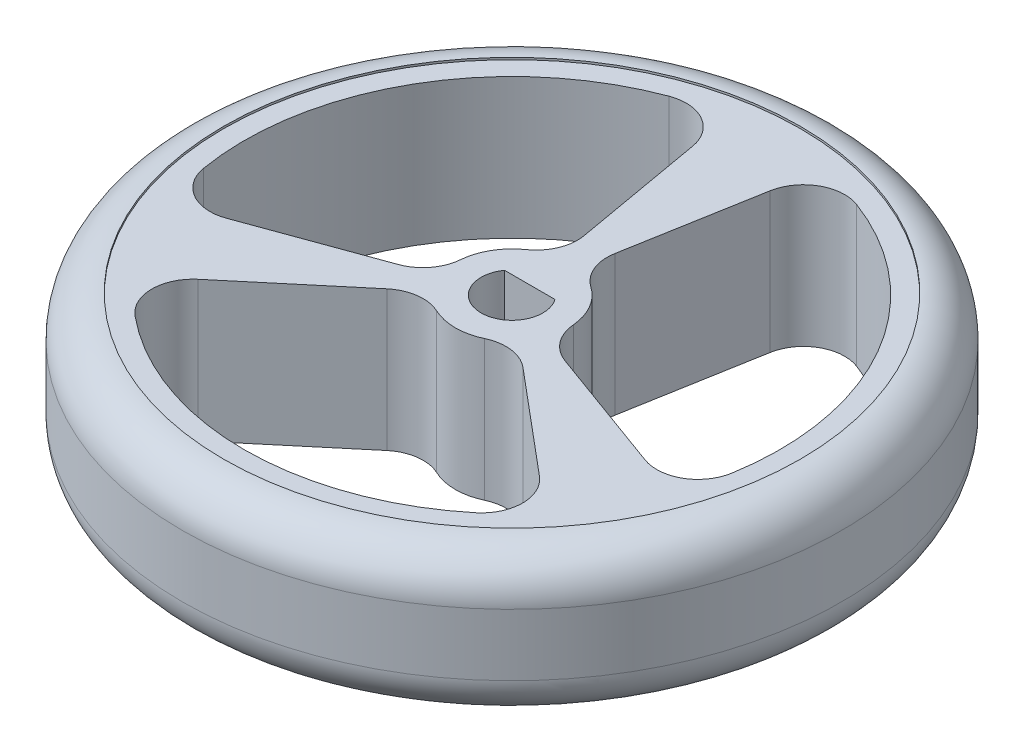
ISO-10303-21;
HEADER;
FILE_DESCRIPTION(('STEP AP214'),'2;1');
FILE_NAME('part.step','',(''),(''),'','','');
FILE_SCHEMA(('AUTOMOTIVE_DESIGN { 1 0 10303 214 1 1 1 1 }'));
ENDSEC;
DATA;
#1=APPLICATION_CONTEXT('core data for automotive mechanical design processes');
#2=APPLICATION_PROTOCOL_DEFINITION('international standard','automotive_design',2000,#1);
#3=PRODUCT_CONTEXT('',#1,'mechanical');
#4=PRODUCT('Part','Part','',(#3));
#5=PRODUCT_RELATED_PRODUCT_CATEGORY('part','',(#4));
#6=PRODUCT_DEFINITION_FORMATION('','',#4);
#7=PRODUCT_DEFINITION_CONTEXT('part definition',#1,'design');
#8=PRODUCT_DEFINITION('design','',#6,#7);
#9=PRODUCT_DEFINITION_SHAPE('','',#8);
#10=(LENGTH_UNIT() NAMED_UNIT(*) SI_UNIT(.MILLI.,.METRE.));
#11=(NAMED_UNIT(*) PLANE_ANGLE_UNIT() SI_UNIT($,.RADIAN.));
#12=(NAMED_UNIT(*) SI_UNIT($,.STERADIAN.) SOLID_ANGLE_UNIT());
#13=UNCERTAINTY_MEASURE_WITH_UNIT(LENGTH_MEASURE(1.E-05),#10,'distance_accuracy_value','');
#14=(GEOMETRIC_REPRESENTATION_CONTEXT(3) GLOBAL_UNCERTAINTY_ASSIGNED_CONTEXT((#13)) GLOBAL_UNIT_ASSIGNED_CONTEXT((#10,
#11,#12)) REPRESENTATION_CONTEXT('',''));
#15=CARTESIAN_POINT('',(0.,0.,0.));
#16=DIRECTION('',(0.,0.,1.));
#17=DIRECTION('',(1.,0.,0.));
#18=AXIS2_PLACEMENT_3D('',#15,#16,#17);
#19=CARTESIAN_POINT('',(0.,3.5,0.));
#20=DIRECTION('',(0.,-1.,0.));
#21=DIRECTION('',(0.,0.,-1.));
#22=AXIS2_PLACEMENT_3D('',#19,#20,#21);
#23=CYLINDRICAL_SURFACE('',#22,1.5);
#24=DIRECTION('',(0.,-1.,0.));
#25=VECTOR('',#24,1.);
#26=CARTESIAN_POINT('',(1.22723011289652,3.5,-0.8625));
#27=LINE('',#26,#25);
#28=CARTESIAN_POINT('',(1.22723011289652,3.4,-0.8625));
#29=VERTEX_POINT('',#28);
#30=CARTESIAN_POINT('',(1.22723011289652,-3.4,-0.8625));
#31=VERTEX_POINT('',#30);
#32=EDGE_CURVE('E361',#29,#31,#27,.T.);
#33=ORIENTED_EDGE('',*,*,#32,.T.);
#34=CARTESIAN_POINT('',(0.,-3.4,0.));
#35=DIRECTION('',(0.,-1.,0.));
#36=DIRECTION('',(0.,0.,-1.));
#37=AXIS2_PLACEMENT_3D('',#34,#35,#36);
#38=CIRCLE('',#37,1.5);
#39=CARTESIAN_POINT('',(-1.22723011289652,-3.4,-0.8625));
#40=VERTEX_POINT('',#39);
#41=EDGE_CURVE('E48',#31,#40,#38,.T.);
#42=ORIENTED_EDGE('',*,*,#41,.T.);
#43=DIRECTION('',(0.,-1.,0.));
#44=VECTOR('',#43,1.);
#45=CARTESIAN_POINT('',(-1.22723011289652,3.5,-0.8625));
#46=LINE('',#45,#44);
#47=CARTESIAN_POINT('',(-1.22723011289652,3.4,-0.8625));
#48=VERTEX_POINT('',#47);
#49=EDGE_CURVE('E364',#48,#40,#46,.T.);
#50=ORIENTED_EDGE('',*,*,#49,.F.);
#51=CARTESIAN_POINT('',(0.,3.4,0.));
#52=DIRECTION('',(0.,1.,0.));
#53=DIRECTION('',(0.,0.,1.));
#54=AXIS2_PLACEMENT_3D('',#51,#52,#53);
#55=CIRCLE('',#54,1.5);
#56=EDGE_CURVE('E358',#48,#29,#55,.T.);
#57=ORIENTED_EDGE('',*,*,#56,.T.);
#58=EDGE_LOOP('',(#33,#42,#50,#57));
#59=FACE_BOUND('',#58,.T.);
#60=ADVANCED_FACE('F34',(#59),#23,.F.);
#61=CARTESIAN_POINT('',(0.,3.5,0.));
#62=DIRECTION('',(0.,-1.,0.));
#63=DIRECTION('',(0.,0.,-1.));
#64=AXIS2_PLACEMENT_3D('',#61,#62,#63);
#65=CYLINDRICAL_SURFACE('',#64,2.75);
#66=CARTESIAN_POINT('',(0.,-3.4,0.));
#67=DIRECTION('',(0.,-1.,0.));
#68=DIRECTION('',(0.,0.,-1.));
#69=AXIS2_PLACEMENT_3D('',#66,#67,#68);
#70=CIRCLE('',#69,2.75);
#71=CARTESIAN_POINT('',(1.57344297134494,-3.4,-2.25538848448005));
#72=VERTEX_POINT('',#71);
#73=CARTESIAN_POINT('',(2.73994520863507,-3.4,-0.234947342350827));
#74=VERTEX_POINT('',#73);
#75=EDGE_CURVE('E412',#72,#74,#70,.T.);
#76=ORIENTED_EDGE('',*,*,#75,.F.);
#77=DIRECTION('',(0.,-1.,0.));
#78=VECTOR('',#77,1.);
#79=CARTESIAN_POINT('',(1.57344297134494,3.5,-2.25538848448005));
#80=LINE('',#79,#78);
#81=CARTESIAN_POINT('',(1.57344297134494,3.4,-2.25538848448005));
#82=VERTEX_POINT('',#81);
#83=EDGE_CURVE('E276',#72,#82,#80,.F.);
#84=ORIENTED_EDGE('',*,*,#83,.T.);
#85=CARTESIAN_POINT('',(0.,3.4,0.));
#86=DIRECTION('',(0.,1.,0.));
#87=DIRECTION('',(0.,0.,1.));
#88=AXIS2_PLACEMENT_3D('',#85,#86,#87);
#89=CIRCLE('',#88,2.75);
#90=CARTESIAN_POINT('',(2.73994520863507,3.4,-0.234947342350827));
#91=VERTEX_POINT('',#90);
#92=EDGE_CURVE('E351',#91,#82,#89,.T.);
#93=ORIENTED_EDGE('',*,*,#92,.F.);
#94=DIRECTION('',(0.,-1.,0.));
#95=VECTOR('',#94,1.);
#96=CARTESIAN_POINT('',(2.73994520863507,3.5,-0.234947342350827));
#97=LINE('',#96,#95);
#98=EDGE_CURVE('E278',#91,#74,#97,.T.);
#99=ORIENTED_EDGE('',*,*,#98,.T.);
#100=EDGE_LOOP('',(#76,#84,#93,#99));
#101=FACE_BOUND('',#100,.T.);
#102=ADVANCED_FACE('F471',(#101),#65,.T.);
#103=CARTESIAN_POINT('',(0.,3.5,0.));
#104=DIRECTION('',(-0.984807753012207,0.,-0.173648177666938));
#105=DIRECTION('',(-0.173648177666938,0.,0.984807753012207));
#106=AXIS2_PLACEMENT_3D('',#103,#104,#105);
#107=PLANE('',#106);
#108=DIRECTION('',(-0.173648177666938,0.,0.984807753012207));
#109=VECTOR('',#108,1.);
#110=CARTESIAN_POINT('',(0.,-3.4,0.));
#111=LINE('',#110,#109);
#112=CARTESIAN_POINT('',(1.87829222540707,-3.4,-10.65232454988));
#113=VERTEX_POINT('',#112);
#114=CARTESIAN_POINT('',(0.748149626298667,-3.4,-4.24296737398123));
#115=VERTEX_POINT('',#114);
#116=EDGE_CURVE('E414',#113,#115,#111,.T.);
#117=ORIENTED_EDGE('',*,*,#116,.F.);
#118=DIRECTION('',(0.,-1.,0.));
#119=VECTOR('',#118,1.);
#120=CARTESIAN_POINT('',(1.87829222540707,3.5,-10.65232454988));
#121=LINE('',#120,#119);
#122=CARTESIAN_POINT('',(1.87829222540707,3.4,-10.65232454988));
#123=VERTEX_POINT('',#122);
#124=EDGE_CURVE('E286',#113,#123,#121,.F.);
#125=ORIENTED_EDGE('',*,*,#124,.T.);
#126=DIRECTION('',(0.173648177666938,0.,-0.984807753012207));
#127=VECTOR('',#126,1.);
#128=CARTESIAN_POINT('',(0.,3.4,0.));
#129=LINE('',#128,#127);
#130=CARTESIAN_POINT('',(0.748149626298667,3.4,-4.24296737398123));
#131=VERTEX_POINT('',#130);
#132=EDGE_CURVE('E348',#131,#123,#129,.T.);
#133=ORIENTED_EDGE('',*,*,#132,.F.);
#134=DIRECTION('',(0.,1.,0.));
#135=VECTOR('',#134,1.);
#136=CARTESIAN_POINT('',(0.748149626298667,-3.5,-4.24296737398123));
#137=LINE('',#136,#135);
#138=EDGE_CURVE('E288',#131,#115,#137,.F.);
#139=ORIENTED_EDGE('',*,*,#138,.T.);
#140=EDGE_LOOP('',(#117,#125,#133,#139));
#141=FACE_BOUND('',#140,.T.);
#142=ADVANCED_FACE('F477',(#141),#107,.F.);
#143=CARTESIAN_POINT('',(0.,3.5,0.));
#144=DIRECTION('',(0.,-1.,0.));
#145=DIRECTION('',(0.,0.,-1.));
#146=AXIS2_PLACEMENT_3D('',#143,#144,#145);
#147=CYLINDRICAL_SURFACE('',#146,13.);
#148=DIRECTION('',(0.,-1.,0.));
#149=VECTOR('',#148,1.);
#150=CARTESIAN_POINT('',(4.54752731896448,3.5,-12.1786696844636));
#151=LINE('',#150,#149);
#152=CARTESIAN_POINT('',(4.54752731896448,3.4,-12.1786696844636));
#153=VERTEX_POINT('',#152);
#154=CARTESIAN_POINT('',(4.54752731896448,-3.4,-12.1786696844636));
#155=VERTEX_POINT('',#154);
#156=EDGE_CURVE('E293',#153,#155,#151,.T.);
#157=ORIENTED_EDGE('',*,*,#156,.T.);
#158=CARTESIAN_POINT('',(0.,-3.4,0.));
#159=DIRECTION('',(0.,-1.,0.));
#160=DIRECTION('',(0.,0.,-1.));
#161=AXIS2_PLACEMENT_3D('',#158,#159,#160);
#162=CIRCLE('',#161,13.);
#163=CARTESIAN_POINT('',(12.8208009905271,-3.4,2.15106065960479));
#164=VERTEX_POINT('',#163);
#165=EDGE_CURVE('E420',#155,#164,#162,.T.);
#166=ORIENTED_EDGE('',*,*,#165,.T.);
#167=DIRECTION('',(0.,-1.,0.));
#168=VECTOR('',#167,1.);
#169=CARTESIAN_POINT('',(12.8208009905271,3.5,2.15106065960479));
#170=LINE('',#169,#168);
#171=CARTESIAN_POINT('',(12.8208009905271,3.4,2.15106065960479));
#172=VERTEX_POINT('',#171);
#173=EDGE_CURVE('E291',#164,#172,#170,.F.);
#174=ORIENTED_EDGE('',*,*,#173,.T.);
#175=CARTESIAN_POINT('',(0.,3.4,0.));
#176=DIRECTION('',(0.,1.,0.));
#177=DIRECTION('',(0.,0.,1.));
#178=AXIS2_PLACEMENT_3D('',#175,#176,#177);
#179=CIRCLE('',#178,13.);
#180=EDGE_CURVE('E341',#172,#153,#179,.T.);
#181=ORIENTED_EDGE('',*,*,#180,.T.);
#182=EDGE_LOOP('',(#157,#166,#174,#181));
#183=FACE_BOUND('',#182,.T.);
#184=ADVANCED_FACE('F494',(#183),#147,.F.);
#185=CARTESIAN_POINT('',(0.,3.5,0.));
#186=DIRECTION('',(-0.984807753012209,0.,0.173648177666924));
#187=DIRECTION('',(0.173648177666924,0.,0.984807753012209));
#188=AXIS2_PLACEMENT_3D('',#185,#186,#187);
#189=PLANE('',#188);
#190=DIRECTION('',(0.,1.,0.));
#191=VECTOR('',#190,1.);
#192=CARTESIAN_POINT('',(-1.87829222540692,-3.5,-10.65232454988));
#193=LINE('',#192,#191);
#194=CARTESIAN_POINT('',(-1.87829222540692,3.4,-10.65232454988));
#195=VERTEX_POINT('',#194);
#196=CARTESIAN_POINT('',(-1.87829222540692,-3.4,-10.65232454988));
#197=VERTEX_POINT('',#196);
#198=EDGE_CURVE('E243',#195,#197,#193,.F.);
#199=ORIENTED_EDGE('',*,*,#198,.T.);
#200=DIRECTION('',(0.173648177666924,0.,0.984807753012209));
#201=VECTOR('',#200,1.);
#202=CARTESIAN_POINT('',(0.,-3.4,0.));
#203=LINE('',#202,#201);
#204=CARTESIAN_POINT('',(-0.748149626298607,-3.4,-4.24296737398124));
#205=VERTEX_POINT('',#204);
#206=EDGE_CURVE('E210',#197,#205,#203,.T.);
#207=ORIENTED_EDGE('',*,*,#206,.T.);
#208=DIRECTION('',(0.,-1.,0.));
#209=VECTOR('',#208,1.);
#210=CARTESIAN_POINT('',(-0.748149626298607,3.5,-4.24296737398124));
#211=LINE('',#210,#209);
#212=CARTESIAN_POINT('',(-0.748149626298607,3.4,-4.24296737398124));
#213=VERTEX_POINT('',#212);
#214=EDGE_CURVE('E245',#205,#213,#211,.F.);
#215=ORIENTED_EDGE('',*,*,#214,.T.);
#216=DIRECTION('',(-0.173648177666924,0.,-0.984807753012209));
#217=VECTOR('',#216,1.);
#218=CARTESIAN_POINT('',(0.,3.4,0.));
#219=LINE('',#218,#217);
#220=EDGE_CURVE('E238',#213,#195,#219,.T.);
#221=ORIENTED_EDGE('',*,*,#220,.T.);
#222=EDGE_LOOP('',(#199,#207,#215,#221));
#223=FACE_BOUND('',#222,.T.);
#224=ADVANCED_FACE('F242',(#223),#189,.T.);
#225=CARTESIAN_POINT('',(0.,-3.4,0.));
#226=DIRECTION('',(0.,-1.,0.));
#227=DIRECTION('',(0.,0.,-1.));
#228=AXIS2_PLACEMENT_3D('',#225,#226,#227);
#229=CIRCLE('',#228,2.75);
#230=CARTESIAN_POINT('',(-2.73994520863508,-3.4,-0.234947342350669));
#231=VERTEX_POINT('',#230);
#232=CARTESIAN_POINT('',(-1.57344297134491,-3.4,-2.25538848448007));
#233=VERTEX_POINT('',#232);
#234=EDGE_CURVE('E379',#231,#233,#229,.T.);
#235=ORIENTED_EDGE('',*,*,#234,.F.);
#236=DIRECTION('',(0.,-1.,0.));
#237=VECTOR('',#236,1.);
#238=CARTESIAN_POINT('',(-2.73994520863508,3.5,-0.234947342350669));
#239=LINE('',#238,#237);
#240=CARTESIAN_POINT('',(-2.73994520863508,3.4,-0.234947342350669));
#241=VERTEX_POINT('',#240);
#242=EDGE_CURVE('E253',#231,#241,#239,.F.);
#243=ORIENTED_EDGE('',*,*,#242,.T.);
#244=CARTESIAN_POINT('',(0.,3.4,0.));
#245=DIRECTION('',(0.,1.,0.));
#246=DIRECTION('',(0.,0.,1.));
#247=AXIS2_PLACEMENT_3D('',#244,#245,#246);
#248=CIRCLE('',#247,2.75);
#249=CARTESIAN_POINT('',(-1.57344297134491,3.4,-2.25538848448007));
#250=VERTEX_POINT('',#249);
#251=EDGE_CURVE('E321',#250,#241,#248,.T.);
#252=ORIENTED_EDGE('',*,*,#251,.F.);
#253=DIRECTION('',(0.,-1.,0.));
#254=VECTOR('',#253,1.);
#255=CARTESIAN_POINT('',(-1.57344297134491,3.5,-2.25538848448007));
#256=LINE('',#255,#254);
#257=EDGE_CURVE('E248',#250,#233,#256,.T.);
#258=ORIENTED_EDGE('',*,*,#257,.T.);
#259=EDGE_LOOP('',(#235,#243,#252,#258));
#260=FACE_BOUND('',#259,.T.);
#261=ADVANCED_FACE('F377',(#260),#65,.T.);
#262=CARTESIAN_POINT('',(0.,3.5,1.4569079967223E-13));
#263=DIRECTION('',(0.342020143325662,0.,0.939692620785911));
#264=DIRECTION('',(0.939692620785911,0.,-0.342020143325662));
#265=AXIS2_PLACEMENT_3D('',#262,#263,#264);
#266=PLANE('',#265);
#267=DIRECTION('',(0.939692620785911,0.,-0.342020143325662));
#268=VECTOR('',#267,1.);
#269=CARTESIAN_POINT('',(0.,-3.4,1.4569079967223E-13));
#270=LINE('',#269,#268);
#271=CARTESIAN_POINT('',(-10.1643297822562,-3.4,3.6995134920068));
#272=VERTEX_POINT('',#271);
#273=CARTESIAN_POINT('',(-4.04859234644564,-3.4,1.4735671047843));
#274=VERTEX_POINT('',#273);
#275=EDGE_CURVE('E393',#272,#274,#270,.T.);
#276=ORIENTED_EDGE('',*,*,#275,.F.);
#277=DIRECTION('',(0.,-1.,0.));
#278=VECTOR('',#277,1.);
#279=CARTESIAN_POINT('',(-10.1643297822562,3.5,3.6995134920068));
#280=LINE('',#279,#278);
#281=CARTESIAN_POINT('',(-10.1643297822562,3.4,3.6995134920068));
#282=VERTEX_POINT('',#281);
#283=EDGE_CURVE('E250',#272,#282,#280,.F.);
#284=ORIENTED_EDGE('',*,*,#283,.T.);
#285=DIRECTION('',(-0.939692620785911,0.,0.342020143325662));
#286=VECTOR('',#285,1.);
#287=CARTESIAN_POINT('',(0.,3.4,1.4569079967223E-13));
#288=LINE('',#287,#286);
#289=CARTESIAN_POINT('',(-4.04859234644564,3.4,1.4735671047843));
#290=VERTEX_POINT('',#289);
#291=EDGE_CURVE('E386',#290,#282,#288,.T.);
#292=ORIENTED_EDGE('',*,*,#291,.F.);
#293=DIRECTION('',(0.,1.,0.));
#294=VECTOR('',#293,1.);
#295=CARTESIAN_POINT('',(-4.04859234644564,-3.5,1.4735671047843));
#296=LINE('',#295,#294);
#297=EDGE_CURVE('E258',#290,#274,#296,.F.);
#298=ORIENTED_EDGE('',*,*,#297,.T.);
#299=EDGE_LOOP('',(#276,#284,#292,#298));
#300=FACE_BOUND('',#299,.T.);
#301=ADVANCED_FACE('F392',(#300),#266,.F.);
#302=CARTESIAN_POINT('',(1.21820169157485E-13,3.5,1.45179624243869E-13));
#303=DIRECTION('',(0.642787609686534,0.,0.766044443118982));
#304=DIRECTION('',(0.766044443118982,0.,-0.642787609686534));
#305=AXIS2_PLACEMENT_3D('',#302,#303,#304);
#306=PLANE('',#305);
#307=DIRECTION('',(0.,1.,0.));
#308=VECTOR('',#307,1.);
#309=CARTESIAN_POINT('',(-8.2860375568491,-3.5,6.95281105787332));
#310=LINE('',#309,#308);
#311=CARTESIAN_POINT('',(-8.2860375568491,3.4,6.95281105787332));
#312=VERTEX_POINT('',#311);
#313=CARTESIAN_POINT('',(-8.2860375568491,-3.4,6.95281105787332));
#314=VERTEX_POINT('',#313);
#315=EDGE_CURVE('E266',#312,#314,#310,.F.);
#316=ORIENTED_EDGE('',*,*,#315,.T.);
#317=DIRECTION('',(0.766044443118982,0.,-0.642787609686534));
#318=VECTOR('',#317,1.);
#319=CARTESIAN_POINT('',(1.21820169157485E-13,-3.4,1.45179624243869E-13));
#320=LINE('',#319,#318);
#321=CARTESIAN_POINT('',(-3.30044272014681,-3.4,2.76940026919714));
#322=VERTEX_POINT('',#321);
#323=EDGE_CURVE('E436',#314,#322,#320,.T.);
#324=ORIENTED_EDGE('',*,*,#323,.T.);
#325=DIRECTION('',(0.,-1.,0.));
#326=VECTOR('',#325,1.);
#327=CARTESIAN_POINT('',(-3.30044272014681,3.5,2.76940026919714));
#328=LINE('',#327,#326);
#329=CARTESIAN_POINT('',(-3.30044272014681,3.4,2.76940026919714));
#330=VERTEX_POINT('',#329);
#331=EDGE_CURVE('E269',#322,#330,#328,.F.);
#332=ORIENTED_EDGE('',*,*,#331,.T.);
#333=DIRECTION('',(-0.766044443118982,0.,0.642787609686534));
#334=VECTOR('',#333,1.);
#335=CARTESIAN_POINT('',(1.21820169157485E-13,3.4,1.45179624243869E-13));
#336=LINE('',#335,#334);
#337=EDGE_CURVE('E315',#330,#312,#336,.T.);
#338=ORIENTED_EDGE('',*,*,#337,.T.);
#339=EDGE_LOOP('',(#316,#324,#332,#338));
#340=FACE_BOUND('',#339,.T.);
#341=ADVANCED_FACE('F503',(#340),#306,.T.);
#342=CARTESIAN_POINT('',(0.,-3.4,0.));
#343=DIRECTION('',(0.,-1.,0.));
#344=DIRECTION('',(0.,0.,-1.));
#345=AXIS2_PLACEMENT_3D('',#342,#343,#344);
#346=CIRCLE('',#345,2.75);
#347=CARTESIAN_POINT('',(1.16650223729025,-3.4,2.49033582683076));
#348=VERTEX_POINT('',#347);
#349=CARTESIAN_POINT('',(-1.16650223729006,-3.4,2.49033582683085));
#350=VERTEX_POINT('',#349);
#351=EDGE_CURVE('E428',#348,#350,#346,.T.);
#352=ORIENTED_EDGE('',*,*,#351,.F.);
#353=DIRECTION('',(0.,-1.,0.));
#354=VECTOR('',#353,1.);
#355=CARTESIAN_POINT('',(1.16650223729025,3.5,2.49033582683076));
#356=LINE('',#355,#354);
#357=CARTESIAN_POINT('',(1.16650223729025,3.4,2.49033582683076));
#358=VERTEX_POINT('',#357);
#359=EDGE_CURVE('E261',#348,#358,#356,.F.);
#360=ORIENTED_EDGE('',*,*,#359,.T.);
#361=CARTESIAN_POINT('',(0.,3.4,0.));
#362=DIRECTION('',(0.,1.,0.));
#363=DIRECTION('',(0.,0.,1.));
#364=AXIS2_PLACEMENT_3D('',#361,#362,#363);
#365=CIRCLE('',#364,2.75);
#366=CARTESIAN_POINT('',(-1.16650223729006,3.4,2.49033582683085));
#367=VERTEX_POINT('',#366);
#368=EDGE_CURVE('E331',#367,#358,#365,.T.);
#369=ORIENTED_EDGE('',*,*,#368,.F.);
#370=DIRECTION('',(0.,-1.,0.));
#371=VECTOR('',#370,1.);
#372=CARTESIAN_POINT('',(-1.16650223729006,3.5,2.49033582683085));
#373=LINE('',#372,#371);
#374=EDGE_CURVE('E263',#367,#350,#373,.T.);
#375=ORIENTED_EDGE('',*,*,#374,.T.);
#376=EDGE_LOOP('',(#352,#360,#369,#375));
#377=FACE_BOUND('',#376,.T.);
#378=ADVANCED_FACE('F480',(#377),#65,.T.);
#379=CARTESIAN_POINT('',(1.22377698535782E-13,3.5,-1.45844061883427E-13));
#380=DIRECTION('',(0.642787609686545,0.,-0.766044443118973));
#381=DIRECTION('',(-0.766044443118973,0.,-0.642787609686545));
#382=AXIS2_PLACEMENT_3D('',#379,#380,#381);
#383=PLANE('',#382);
#384=DIRECTION('',(-0.766044443118973,0.,-0.642787609686545));
#385=VECTOR('',#384,1.);
#386=CARTESIAN_POINT('',(1.22377698535782E-13,-3.4,-1.45844061883427E-13));
#387=LINE('',#386,#385);
#388=CARTESIAN_POINT('',(8.2860375568493,-3.4,6.95281105787319));
#389=VERTEX_POINT('',#388);
#390=CARTESIAN_POINT('',(3.30044272014715,-3.4,2.769400269197));
#391=VERTEX_POINT('',#390);
#392=EDGE_CURVE('E430',#389,#391,#387,.T.);
#393=ORIENTED_EDGE('',*,*,#392,.F.);
#394=DIRECTION('',(0.,-1.,0.));
#395=VECTOR('',#394,1.);
#396=CARTESIAN_POINT('',(8.2860375568493,3.5,6.95281105787319));
#397=LINE('',#396,#395);
#398=CARTESIAN_POINT('',(8.2860375568493,3.4,6.95281105787319));
#399=VERTEX_POINT('',#398);
#400=EDGE_CURVE('E271',#389,#399,#397,.F.);
#401=ORIENTED_EDGE('',*,*,#400,.T.);
#402=DIRECTION('',(0.766044443118973,0.,0.642787609686545));
#403=VECTOR('',#402,1.);
#404=CARTESIAN_POINT('',(1.22377698535782E-13,3.4,-1.45844061883427E-13));
#405=LINE('',#404,#403);
#406=CARTESIAN_POINT('',(3.30044272014715,3.4,2.769400269197));
#407=VERTEX_POINT('',#406);
#408=EDGE_CURVE('E329',#407,#399,#405,.T.);
#409=ORIENTED_EDGE('',*,*,#408,.F.);
#410=DIRECTION('',(0.,1.,0.));
#411=VECTOR('',#410,1.);
#412=CARTESIAN_POINT('',(3.30044272014715,-3.5,2.769400269197));
#413=LINE('',#412,#411);
#414=EDGE_CURVE('E273',#407,#391,#413,.F.);
#415=ORIENTED_EDGE('',*,*,#414,.T.);
#416=EDGE_LOOP('',(#393,#401,#409,#415));
#417=FACE_BOUND('',#416,.T.);
#418=ADVANCED_FACE('F492',(#417),#383,.F.);
#419=CARTESIAN_POINT('',(0.,3.5,-1.45181391281766E-13));
#420=DIRECTION('',(0.342020143325675,0.,-0.939692620785906));
#421=DIRECTION('',(-0.939692620785906,0.,-0.342020143325675));
#422=AXIS2_PLACEMENT_3D('',#419,#420,#421);
#423=PLANE('',#422);
#424=DIRECTION('',(0.,1.,0.));
#425=VECTOR('',#424,1.);
#426=CARTESIAN_POINT('',(10.1643297822562,-3.5,3.69951349200664));
#427=LINE('',#426,#425);
#428=CARTESIAN_POINT('',(10.1643297822562,3.4,3.69951349200664));
#429=VERTEX_POINT('',#428);
#430=CARTESIAN_POINT('',(10.1643297822562,-3.4,3.69951349200664));
#431=VERTEX_POINT('',#430);
#432=EDGE_CURVE('E281',#429,#431,#427,.F.);
#433=ORIENTED_EDGE('',*,*,#432,.T.);
#434=DIRECTION('',(-0.939692620785906,0.,-0.342020143325675));
#435=VECTOR('',#434,1.);
#436=CARTESIAN_POINT('',(0.,-3.4,-1.45181391281766E-13));
#437=LINE('',#436,#435);
#438=CARTESIAN_POINT('',(4.04859234644559,-3.4,1.47356710478402));
#439=VERTEX_POINT('',#438);
#440=EDGE_CURVE('E56',#431,#439,#437,.T.);
#441=ORIENTED_EDGE('',*,*,#440,.T.);
#442=DIRECTION('',(0.,-1.,0.));
#443=VECTOR('',#442,1.);
#444=CARTESIAN_POINT('',(4.04859234644559,3.5,1.47356710478402));
#445=LINE('',#444,#443);
#446=CARTESIAN_POINT('',(4.04859234644559,3.4,1.47356710478402));
#447=VERTEX_POINT('',#446);
#448=EDGE_CURVE('E284',#439,#447,#445,.F.);
#449=ORIENTED_EDGE('',*,*,#448,.T.);
#450=DIRECTION('',(0.939692620785906,0.,0.342020143325675));
#451=VECTOR('',#450,1.);
#452=CARTESIAN_POINT('',(0.,3.4,-1.45181391281766E-13));
#453=LINE('',#452,#451);
#454=EDGE_CURVE('E338',#447,#429,#453,.T.);
#455=ORIENTED_EDGE('',*,*,#454,.T.);
#456=EDGE_LOOP('',(#433,#441,#449,#455));
#457=FACE_BOUND('',#456,.T.);
#458=ADVANCED_FACE('F489',(#457),#423,.T.);
#459=DIRECTION('',(0.,-1.,0.));
#460=VECTOR('',#459,1.);
#461=CARTESIAN_POINT('',(-12.8208009905271,3.5,2.15106065960498));
#462=LINE('',#461,#460);
#463=CARTESIAN_POINT('',(-12.8208009905271,3.4,2.15106065960498));
#464=VERTEX_POINT('',#463);
#465=CARTESIAN_POINT('',(-12.8208009905271,-3.4,2.15106065960498));
#466=VERTEX_POINT('',#465);
#467=EDGE_CURVE('E222',#464,#466,#462,.T.);
#468=ORIENTED_EDGE('',*,*,#467,.T.);
#469=CARTESIAN_POINT('',(0.,-3.4,0.));
#470=DIRECTION('',(0.,-1.,0.));
#471=DIRECTION('',(0.,0.,-1.));
#472=AXIS2_PLACEMENT_3D('',#469,#470,#471);
#473=CIRCLE('',#472,13.);
#474=CARTESIAN_POINT('',(-4.54752731896431,-3.4,-12.1786696844636));
#475=VERTEX_POINT('',#474);
#476=EDGE_CURVE('E207',#466,#475,#473,.T.);
#477=ORIENTED_EDGE('',*,*,#476,.T.);
#478=DIRECTION('',(0.,-1.,0.));
#479=VECTOR('',#478,1.);
#480=CARTESIAN_POINT('',(-4.54752731896431,3.5,-12.1786696844636));
#481=LINE('',#480,#479);
#482=CARTESIAN_POINT('',(-4.54752731896431,3.4,-12.1786696844636));
#483=VERTEX_POINT('',#482);
#484=EDGE_CURVE('E219',#475,#483,#481,.F.);
#485=ORIENTED_EDGE('',*,*,#484,.T.);
#486=CARTESIAN_POINT('',(0.,3.4,0.));
#487=DIRECTION('',(0.,1.,0.));
#488=DIRECTION('',(0.,0.,1.));
#489=AXIS2_PLACEMENT_3D('',#486,#487,#488);
#490=CIRCLE('',#489,13.);
#491=EDGE_CURVE('E240',#483,#464,#490,.T.);
#492=ORIENTED_EDGE('',*,*,#491,.T.);
#493=EDGE_LOOP('',(#468,#477,#485,#492));
#494=FACE_BOUND('',#493,.T.);
#495=ADVANCED_FACE('F217',(#494),#147,.F.);
#496=DIRECTION('',(0.,-1.,0.));
#497=VECTOR('',#496,1.);
#498=CARTESIAN_POINT('',(8.27327367156279,3.5,10.0276090248586));
#499=LINE('',#498,#497);
#500=CARTESIAN_POINT('',(8.27327367156279,3.4,10.0276090248586));
#501=VERTEX_POINT('',#500);
#502=CARTESIAN_POINT('',(8.27327367156279,-3.4,10.0276090248586));
#503=VERTEX_POINT('',#502);
#504=EDGE_CURVE('E226',#501,#503,#499,.T.);
#505=ORIENTED_EDGE('',*,*,#504,.T.);
#506=CARTESIAN_POINT('',(0.,-3.4,0.));
#507=DIRECTION('',(0.,-1.,0.));
#508=DIRECTION('',(0.,0.,-1.));
#509=AXIS2_PLACEMENT_3D('',#506,#507,#508);
#510=CIRCLE('',#509,13.);
#511=CARTESIAN_POINT('',(-8.27327367156258,-3.4,10.0276090248588));
#512=VERTEX_POINT('',#511);
#513=EDGE_CURVE('E303',#503,#512,#510,.T.);
#514=ORIENTED_EDGE('',*,*,#513,.T.);
#515=DIRECTION('',(0.,-1.,0.));
#516=VECTOR('',#515,1.);
#517=CARTESIAN_POINT('',(-8.27327367156258,3.5,10.0276090248588));
#518=LINE('',#517,#516);
#519=CARTESIAN_POINT('',(-8.27327367156258,3.4,10.0276090248588));
#520=VERTEX_POINT('',#519);
#521=EDGE_CURVE('E230',#512,#520,#518,.F.);
#522=ORIENTED_EDGE('',*,*,#521,.T.);
#523=CARTESIAN_POINT('',(0.,3.4,0.));
#524=DIRECTION('',(0.,1.,0.));
#525=DIRECTION('',(0.,0.,1.));
#526=AXIS2_PLACEMENT_3D('',#523,#524,#525);
#527=CIRCLE('',#526,13.);
#528=EDGE_CURVE('E301',#520,#501,#527,.T.);
#529=ORIENTED_EDGE('',*,*,#528,.T.);
#530=EDGE_LOOP('',(#505,#514,#522,#529));
#531=FACE_BOUND('',#530,.T.);
#532=ADVANCED_FACE('F300',(#531),#147,.F.);
#533=CARTESIAN_POINT('',(0.,3.5,-0.8625));
#534=DIRECTION('',(0.,0.,-1.));
#535=DIRECTION('',(-1.,0.,0.));
#536=AXIS2_PLACEMENT_3D('',#533,#534,#535);
#537=PLANE('',#536);
#538=DIRECTION('',(-1.,0.,0.));
#539=VECTOR('',#538,1.);
#540=CARTESIAN_POINT('',(0.,-3.4,-0.8625));
#541=LINE('',#540,#539);
#542=EDGE_CURVE('E408',#31,#40,#541,.T.);
#543=ORIENTED_EDGE('',*,*,#542,.F.);
#544=ORIENTED_EDGE('',*,*,#32,.F.);
#545=DIRECTION('',(1.,0.,0.));
#546=VECTOR('',#545,1.);
#547=CARTESIAN_POINT('',(0.,3.4,-0.8625));
#548=LINE('',#547,#546);
#549=EDGE_CURVE('E356',#48,#29,#548,.T.);
#550=ORIENTED_EDGE('',*,*,#549,.F.);
#551=ORIENTED_EDGE('',*,*,#49,.T.);
#552=EDGE_LOOP('',(#543,#544,#550,#551));
#553=FACE_BOUND('',#552,.T.);
#554=ADVANCED_FACE('F483',(#553),#537,.F.);
#555=CARTESIAN_POINT('',(-2.71776513232303,3.5,-3.89567101864739));
#556=DIRECTION('',(0.,-1.,0.));
#557=DIRECTION('',(0.,0.,-1.));
#558=AXIS2_PLACEMENT_3D('',#555,#556,#557);
#559=CYLINDRICAL_SURFACE('',#558,2.);
#560=CARTESIAN_POINT('',(-2.71776513232303,-3.4,-3.89567101864739));
#561=DIRECTION('',(0.,-1.,0.));
#562=DIRECTION('',(0.,0.,-1.));
#563=AXIS2_PLACEMENT_3D('',#560,#561,#562);
#564=CIRCLE('',#563,2.);
#565=EDGE_CURVE('E445',#233,#205,#564,.F.);
#566=ORIENTED_EDGE('',*,*,#565,.F.);
#567=ORIENTED_EDGE('',*,*,#257,.F.);
#568=CARTESIAN_POINT('',(-2.71776513232303,3.4,-3.89567101864739));
#569=DIRECTION('',(0.,1.,0.));
#570=DIRECTION('',(0.,0.,1.));
#571=AXIS2_PLACEMENT_3D('',#568,#569,#570);
#572=CIRCLE('',#571,2.);
#573=EDGE_CURVE('E385',#213,#250,#572,.F.);
#574=ORIENTED_EDGE('',*,*,#573,.F.);
#575=ORIENTED_EDGE('',*,*,#214,.F.);
#576=EDGE_LOOP('',(#566,#567,#574,#575));
#577=FACE_BOUND('',#576,.T.);
#578=ADVANCED_FACE('F519',(#577),#559,.F.);
#579=CARTESIAN_POINT('',(-4.73263263309696,3.5,-0.405818136787518));
#580=DIRECTION('',(0.,-1.,0.));
#581=DIRECTION('',(0.,0.,-1.));
#582=AXIS2_PLACEMENT_3D('',#579,#580,#581);
#583=CYLINDRICAL_SURFACE('',#582,2.);
#584=CARTESIAN_POINT('',(-4.73263263309696,-3.4,-0.405818136787518));
#585=DIRECTION('',(0.,-1.,0.));
#586=DIRECTION('',(0.,0.,-1.));
#587=AXIS2_PLACEMENT_3D('',#584,#585,#586);
#588=CIRCLE('',#587,2.);
#589=EDGE_CURVE('E389',#274,#231,#588,.F.);
#590=ORIENTED_EDGE('',*,*,#589,.F.);
#591=ORIENTED_EDGE('',*,*,#297,.F.);
#592=CARTESIAN_POINT('',(-4.73263263309696,3.4,-0.405818136787518));
#593=DIRECTION('',(0.,1.,0.));
#594=DIRECTION('',(0.,0.,1.));
#595=AXIS2_PLACEMENT_3D('',#592,#593,#594);
#596=CIRCLE('',#595,2.);
#597=EDGE_CURVE('E319',#241,#290,#596,.F.);
#598=ORIENTED_EDGE('',*,*,#597,.F.);
#599=ORIENTED_EDGE('',*,*,#242,.F.);
#600=EDGE_LOOP('',(#590,#591,#598,#599));
#601=FACE_BOUND('',#600,.T.);
#602=ADVANCED_FACE('F388',(#601),#583,.F.);
#603=CARTESIAN_POINT('',(-2.01486750077374,3.5,4.3014891554351));
#604=DIRECTION('',(0.,-1.,0.));
#605=DIRECTION('',(0.,0.,-1.));
#606=AXIS2_PLACEMENT_3D('',#603,#604,#605);
#607=CYLINDRICAL_SURFACE('',#606,2.);
#608=CARTESIAN_POINT('',(-2.01486750077374,-3.4,4.3014891554351));
#609=DIRECTION('',(0.,-1.,0.));
#610=DIRECTION('',(0.,0.,-1.));
#611=AXIS2_PLACEMENT_3D('',#608,#609,#610);
#612=CIRCLE('',#611,2.);
#613=EDGE_CURVE('E432',#350,#322,#612,.F.);
#614=ORIENTED_EDGE('',*,*,#613,.F.);
#615=ORIENTED_EDGE('',*,*,#374,.F.);
#616=CARTESIAN_POINT('',(-2.01486750077374,3.4,4.3014891554351));
#617=DIRECTION('',(0.,1.,0.));
#618=DIRECTION('',(0.,0.,1.));
#619=AXIS2_PLACEMENT_3D('',#616,#617,#618);
#620=CIRCLE('',#619,2.);
#621=EDGE_CURVE('E327',#330,#367,#620,.F.);
#622=ORIENTED_EDGE('',*,*,#621,.F.);
#623=ORIENTED_EDGE('',*,*,#331,.F.);
#624=EDGE_LOOP('',(#614,#615,#622,#623));
#625=FACE_BOUND('',#624,.T.);
#626=ADVANCED_FACE('F525',(#625),#607,.F.);
#627=CARTESIAN_POINT('',(2.01486750077406,3.5,4.30148915543495));
#628=DIRECTION('',(0.,-1.,0.));
#629=DIRECTION('',(0.,0.,-1.));
#630=AXIS2_PLACEMENT_3D('',#627,#628,#629);
#631=CYLINDRICAL_SURFACE('',#630,2.);
#632=CARTESIAN_POINT('',(2.01486750077406,-3.4,4.30148915543495));
#633=DIRECTION('',(0.,-1.,0.));
#634=DIRECTION('',(0.,0.,-1.));
#635=AXIS2_PLACEMENT_3D('',#632,#633,#634);
#636=CIRCLE('',#635,2.);
#637=EDGE_CURVE('E426',#391,#348,#636,.F.);
#638=ORIENTED_EDGE('',*,*,#637,.F.);
#639=ORIENTED_EDGE('',*,*,#414,.F.);
#640=CARTESIAN_POINT('',(2.01486750077406,3.4,4.30148915543495));
#641=DIRECTION('',(0.,1.,0.));
#642=DIRECTION('',(0.,0.,1.));
#643=AXIS2_PLACEMENT_3D('',#640,#641,#642);
#644=CIRCLE('',#643,2.);
#645=EDGE_CURVE('E334',#358,#407,#644,.F.);
#646=ORIENTED_EDGE('',*,*,#645,.F.);
#647=ORIENTED_EDGE('',*,*,#359,.F.);
#648=EDGE_LOOP('',(#638,#639,#646,#647));
#649=FACE_BOUND('',#648,.T.);
#650=ADVANCED_FACE('F528',(#649),#631,.F.);
#651=CARTESIAN_POINT('',(4.73263263309694,3.5,-0.405818136787792));
#652=DIRECTION('',(0.,-1.,0.));
#653=DIRECTION('',(0.,0.,-1.));
#654=AXIS2_PLACEMENT_3D('',#651,#652,#653);
#655=CYLINDRICAL_SURFACE('',#654,2.);
#656=CARTESIAN_POINT('',(4.73263263309694,-3.4,-0.405818136787792));
#657=DIRECTION('',(0.,-1.,0.));
#658=DIRECTION('',(0.,0.,-1.));
#659=AXIS2_PLACEMENT_3D('',#656,#657,#658);
#660=CIRCLE('',#659,2.);
#661=EDGE_CURVE('E416',#74,#439,#660,.F.);
#662=ORIENTED_EDGE('',*,*,#661,.F.);
#663=ORIENTED_EDGE('',*,*,#98,.F.);
#664=CARTESIAN_POINT('',(4.73263263309694,3.4,-0.405818136787792));
#665=DIRECTION('',(0.,1.,0.));
#666=DIRECTION('',(0.,0.,1.));
#667=AXIS2_PLACEMENT_3D('',#664,#665,#666);
#668=CIRCLE('',#667,2.);
#669=EDGE_CURVE('E346',#447,#91,#668,.F.);
#670=ORIENTED_EDGE('',*,*,#669,.F.);
#671=ORIENTED_EDGE('',*,*,#448,.F.);
#672=EDGE_LOOP('',(#662,#663,#670,#671));
#673=FACE_BOUND('',#672,.T.);
#674=ADVANCED_FACE('F532',(#673),#655,.F.);
#675=CARTESIAN_POINT('',(2.71776513232308,3.5,-3.89567101864735));
#676=DIRECTION('',(0.,-1.,0.));
#677=DIRECTION('',(0.,0.,-1.));
#678=AXIS2_PLACEMENT_3D('',#675,#676,#677);
#679=CYLINDRICAL_SURFACE('',#678,2.);
#680=CARTESIAN_POINT('',(2.71776513232308,-3.4,-3.89567101864735));
#681=DIRECTION('',(0.,-1.,0.));
#682=DIRECTION('',(0.,0.,-1.));
#683=AXIS2_PLACEMENT_3D('',#680,#681,#682);
#684=CIRCLE('',#683,2.);
#685=EDGE_CURVE('E410',#115,#72,#684,.F.);
#686=ORIENTED_EDGE('',*,*,#685,.F.);
#687=ORIENTED_EDGE('',*,*,#138,.F.);
#688=CARTESIAN_POINT('',(2.71776513232308,3.4,-3.89567101864735));
#689=DIRECTION('',(0.,1.,0.));
#690=DIRECTION('',(0.,0.,1.));
#691=AXIS2_PLACEMENT_3D('',#688,#689,#690);
#692=CIRCLE('',#691,2.);
#693=EDGE_CURVE('E354',#82,#131,#692,.F.);
#694=ORIENTED_EDGE('',*,*,#693,.F.);
#695=ORIENTED_EDGE('',*,*,#83,.F.);
#696=EDGE_LOOP('',(#686,#687,#694,#695));
#697=FACE_BOUND('',#696,.T.);
#698=ADVANCED_FACE('F536',(#697),#679,.F.);
#699=CARTESIAN_POINT('',(3.84790773143149,3.5,-10.3050281945461));
#700=DIRECTION('',(0.,-1.,0.));
#701=DIRECTION('',(0.,0.,-1.));
#702=AXIS2_PLACEMENT_3D('',#699,#700,#701);
#703=CYLINDRICAL_SURFACE('',#702,2.);
#704=CARTESIAN_POINT('',(3.84790773143149,-3.4,-10.3050281945461));
#705=DIRECTION('',(0.,-1.,0.));
#706=DIRECTION('',(0.,0.,-1.));
#707=AXIS2_PLACEMENT_3D('',#704,#705,#706);
#708=CIRCLE('',#707,2.);
#709=EDGE_CURVE('E418',#155,#113,#708,.F.);
#710=ORIENTED_EDGE('',*,*,#709,.F.);
#711=ORIENTED_EDGE('',*,*,#156,.F.);
#712=CARTESIAN_POINT('',(3.84790773143149,3.4,-10.3050281945461));
#713=DIRECTION('',(0.,1.,0.));
#714=DIRECTION('',(0.,0.,1.));
#715=AXIS2_PLACEMENT_3D('',#712,#713,#714);
#716=CIRCLE('',#715,2.);
#717=EDGE_CURVE('E344',#123,#153,#716,.F.);
#718=ORIENTED_EDGE('',*,*,#717,.F.);
#719=ORIENTED_EDGE('',*,*,#124,.F.);
#720=EDGE_LOOP('',(#710,#711,#718,#719));
#721=FACE_BOUND('',#720,.T.);
#722=ADVANCED_FACE('F540',(#721),#703,.F.);
#723=CARTESIAN_POINT('',(10.8483700689075,3.5,1.82012825043482));
#724=DIRECTION('',(0.,-1.,0.));
#725=DIRECTION('',(0.,0.,-1.));
#726=AXIS2_PLACEMENT_3D('',#723,#724,#725);
#727=CYLINDRICAL_SURFACE('',#726,2.);
#728=CARTESIAN_POINT('',(10.8483700689075,-3.4,1.82012825043482));
#729=DIRECTION('',(0.,-1.,0.));
#730=DIRECTION('',(0.,0.,-1.));
#731=AXIS2_PLACEMENT_3D('',#728,#729,#730);
#732=CIRCLE('',#731,2.);
#733=EDGE_CURVE('E424',#431,#164,#732,.F.);
#734=ORIENTED_EDGE('',*,*,#733,.F.);
#735=ORIENTED_EDGE('',*,*,#432,.F.);
#736=CARTESIAN_POINT('',(10.8483700689075,3.4,1.82012825043482));
#737=DIRECTION('',(0.,1.,0.));
#738=DIRECTION('',(0.,0.,1.));
#739=AXIS2_PLACEMENT_3D('',#736,#737,#738);
#740=CIRCLE('',#739,2.);
#741=EDGE_CURVE('E336',#172,#429,#740,.F.);
#742=ORIENTED_EDGE('',*,*,#741,.F.);
#743=ORIENTED_EDGE('',*,*,#173,.F.);
#744=EDGE_LOOP('',(#734,#735,#742,#743));
#745=FACE_BOUND('',#744,.T.);
#746=ADVANCED_FACE('F544',(#745),#727,.F.);
#747=CARTESIAN_POINT('',(7.00046233747621,3.5,8.48489994411114));
#748=DIRECTION('',(0.,-1.,0.));
#749=DIRECTION('',(0.,0.,-1.));
#750=AXIS2_PLACEMENT_3D('',#747,#748,#749);
#751=CYLINDRICAL_SURFACE('',#750,2.);
#752=CARTESIAN_POINT('',(7.00046233747621,-3.4,8.48489994411114));
#753=DIRECTION('',(0.,-1.,0.));
#754=DIRECTION('',(0.,0.,-1.));
#755=AXIS2_PLACEMENT_3D('',#752,#753,#754);
#756=CIRCLE('',#755,2.);
#757=EDGE_CURVE('E434',#503,#389,#756,.F.);
#758=ORIENTED_EDGE('',*,*,#757,.F.);
#759=ORIENTED_EDGE('',*,*,#504,.F.);
#760=CARTESIAN_POINT('',(7.00046233747621,3.4,8.48489994411114));
#761=DIRECTION('',(0.,1.,0.));
#762=DIRECTION('',(0.,0.,1.));
#763=AXIS2_PLACEMENT_3D('',#760,#761,#762);
#764=CIRCLE('',#763,2.);
#765=EDGE_CURVE('E314',#399,#501,#764,.F.);
#766=ORIENTED_EDGE('',*,*,#765,.F.);
#767=ORIENTED_EDGE('',*,*,#400,.F.);
#768=EDGE_LOOP('',(#758,#759,#766,#767));
#769=FACE_BOUND('',#768,.T.);
#770=ADVANCED_FACE('F548',(#769),#751,.F.);
#771=CARTESIAN_POINT('',(-7.00046233747603,3.5,8.48489994411128));
#772=DIRECTION('',(0.,-1.,0.));
#773=DIRECTION('',(0.,0.,-1.));
#774=AXIS2_PLACEMENT_3D('',#771,#772,#773);
#775=CYLINDRICAL_SURFACE('',#774,2.);
#776=CARTESIAN_POINT('',(-7.00046233747603,-3.4,8.48489994411128));
#777=DIRECTION('',(0.,-1.,0.));
#778=DIRECTION('',(0.,0.,-1.));
#779=AXIS2_PLACEMENT_3D('',#776,#777,#778);
#780=CIRCLE('',#779,2.);
#781=EDGE_CURVE('E440',#314,#512,#780,.F.);
#782=ORIENTED_EDGE('',*,*,#781,.F.);
#783=ORIENTED_EDGE('',*,*,#315,.F.);
#784=CARTESIAN_POINT('',(-7.00046233747603,3.4,8.48489994411128));
#785=DIRECTION('',(0.,1.,0.));
#786=DIRECTION('',(0.,0.,1.));
#787=AXIS2_PLACEMENT_3D('',#784,#785,#786);
#788=CIRCLE('',#787,2.);
#789=EDGE_CURVE('E310',#520,#312,#788,.F.);
#790=ORIENTED_EDGE('',*,*,#789,.F.);
#791=ORIENTED_EDGE('',*,*,#521,.F.);
#792=EDGE_LOOP('',(#782,#783,#790,#791));
#793=FACE_BOUND('',#792,.T.);
#794=ADVANCED_FACE('F318',(#793),#775,.F.);
#795=CARTESIAN_POINT('',(-10.8483700689075,3.5,1.82012825043498));
#796=DIRECTION('',(0.,-1.,0.));
#797=DIRECTION('',(0.,0.,-1.));
#798=AXIS2_PLACEMENT_3D('',#795,#796,#797);
#799=CYLINDRICAL_SURFACE('',#798,2.);
#800=CARTESIAN_POINT('',(-10.8483700689075,-3.4,1.82012825043498));
#801=DIRECTION('',(0.,-1.,0.));
#802=DIRECTION('',(0.,0.,-1.));
#803=AXIS2_PLACEMENT_3D('',#800,#801,#802);
#804=CIRCLE('',#803,2.);
#805=EDGE_CURVE('E447',#466,#272,#804,.F.);
#806=ORIENTED_EDGE('',*,*,#805,.F.);
#807=ORIENTED_EDGE('',*,*,#467,.F.);
#808=CARTESIAN_POINT('',(-10.8483700689075,3.4,1.82012825043498));
#809=DIRECTION('',(0.,1.,0.));
#810=DIRECTION('',(0.,0.,1.));
#811=AXIS2_PLACEMENT_3D('',#808,#809,#810);
#812=CIRCLE('',#811,2.);
#813=EDGE_CURVE('E246',#282,#464,#812,.F.);
#814=ORIENTED_EDGE('',*,*,#813,.F.);
#815=ORIENTED_EDGE('',*,*,#283,.F.);
#816=EDGE_LOOP('',(#806,#807,#814,#815));
#817=FACE_BOUND('',#816,.T.);
#818=ADVANCED_FACE('F554',(#817),#799,.F.);
#819=CARTESIAN_POINT('',(-3.84790773143134,3.5,-10.3050281945461));
#820=DIRECTION('',(0.,-1.,0.));
#821=DIRECTION('',(0.,0.,-1.));
#822=AXIS2_PLACEMENT_3D('',#819,#820,#821);
#823=CYLINDRICAL_SURFACE('',#822,2.);
#824=CARTESIAN_POINT('',(-3.84790773143134,-3.4,-10.3050281945461));
#825=DIRECTION('',(0.,-1.,0.));
#826=DIRECTION('',(0.,0.,-1.));
#827=AXIS2_PLACEMENT_3D('',#824,#825,#826);
#828=CIRCLE('',#827,2.);
#829=EDGE_CURVE('E11',#197,#475,#828,.F.);
#830=ORIENTED_EDGE('',*,*,#829,.F.);
#831=ORIENTED_EDGE('',*,*,#198,.F.);
#832=CARTESIAN_POINT('',(-3.84790773143134,3.4,-10.3050281945461));
#833=DIRECTION('',(0.,1.,0.));
#834=DIRECTION('',(0.,0.,1.));
#835=AXIS2_PLACEMENT_3D('',#832,#833,#834);
#836=CIRCLE('',#835,2.);
#837=EDGE_CURVE('E42',#483,#195,#836,.F.);
#838=ORIENTED_EDGE('',*,*,#837,.F.);
#839=ORIENTED_EDGE('',*,*,#484,.F.);
#840=EDGE_LOOP('',(#830,#831,#838,#839));
#841=FACE_BOUND('',#840,.T.);
#842=ADVANCED_FACE('F36',(#841),#823,.F.);
#843=CARTESIAN_POINT('',(0.,3.5,0.));
#844=DIRECTION('',(0.,-1.,0.));
#845=DIRECTION('',(0.,0.,-1.));
#846=AXIS2_PLACEMENT_3D('',#843,#844,#845);
#847=CYLINDRICAL_SURFACE('',#846,16.);
#848=CARTESIAN_POINT('',(0.,-1.5,0.));
#849=DIRECTION('',(0.,1.,0.));
#850=DIRECTION('',(0.,0.,1.));
#851=AXIS2_PLACEMENT_3D('',#848,#849,#850);
#852=CIRCLE('',#851,16.);
#853=CARTESIAN_POINT('',(0.,-1.5,16.));
#854=VERTEX_POINT('',#853);
#855=EDGE_CURVE('E370',#854,#854,#852,.T.);
#856=ORIENTED_EDGE('',*,*,#855,.T.);
#857=EDGE_LOOP('',(#856));
#858=FACE_BOUND('',#857,.T.);
#859=CARTESIAN_POINT('',(0.,1.5,0.));
#860=DIRECTION('',(0.,1.,0.));
#861=DIRECTION('',(0.,0.,1.));
#862=AXIS2_PLACEMENT_3D('',#859,#860,#861);
#863=CIRCLE('',#862,16.);
#864=CARTESIAN_POINT('',(0.,1.5,16.));
#865=VERTEX_POINT('',#864);
#866=EDGE_CURVE('E367',#865,#865,#863,.F.);
#867=ORIENTED_EDGE('',*,*,#866,.T.);
#868=EDGE_LOOP('',(#867));
#869=FACE_BOUND('',#868,.T.);
#870=ADVANCED_FACE('F484',(#858,#869),#847,.T.);
#871=CARTESIAN_POINT('',(0.,-1.5,0.));
#872=DIRECTION('',(0.,1.,0.));
#873=DIRECTION('',(0.,0.,1.));
#874=AXIS2_PLACEMENT_3D('',#871,#872,#873);
#875=TOROIDAL_SURFACE('',#874,14.,2.);
#876=CARTESIAN_POINT('',(0.,-3.5,0.));
#877=DIRECTION('',(0.,1.,0.));
#878=DIRECTION('',(0.,0.,1.));
#879=AXIS2_PLACEMENT_3D('',#876,#877,#878);
#880=CIRCLE('',#879,14.);
#881=CARTESIAN_POINT('',(0.,-3.5,14.));
#882=VERTEX_POINT('',#881);
#883=EDGE_CURVE('E450',#882,#882,#880,.T.);
#884=ORIENTED_EDGE('',*,*,#883,.T.);
#885=EDGE_LOOP('',(#884));
#886=FACE_BOUND('',#885,.T.);
#887=ORIENTED_EDGE('',*,*,#855,.F.);
#888=EDGE_LOOP('',(#887));
#889=FACE_BOUND('',#888,.T.);
#890=ADVANCED_FACE('F487',(#886,#889),#875,.T.);
#891=CARTESIAN_POINT('',(0.,1.5,0.));
#892=DIRECTION('',(0.,1.,0.));
#893=DIRECTION('',(0.,0.,1.));
#894=AXIS2_PLACEMENT_3D('',#891,#892,#893);
#895=TOROIDAL_SURFACE('',#894,14.,2.);
#896=ORIENTED_EDGE('',*,*,#866,.F.);
#897=EDGE_LOOP('',(#896));
#898=FACE_BOUND('',#897,.T.);
#899=CARTESIAN_POINT('',(0.,3.5,0.));
#900=DIRECTION('',(0.,1.,0.));
#901=DIRECTION('',(0.,0.,1.));
#902=AXIS2_PLACEMENT_3D('',#899,#900,#901);
#903=CIRCLE('',#902,14.);
#904=CARTESIAN_POINT('',(0.,3.5,14.));
#905=VERTEX_POINT('',#904);
#906=EDGE_CURVE('E402',#905,#905,#903,.T.);
#907=ORIENTED_EDGE('',*,*,#906,.F.);
#908=EDGE_LOOP('',(#907));
#909=FACE_BOUND('',#908,.T.);
#910=ADVANCED_FACE('F514',(#898,#909),#895,.T.);
#911=CARTESIAN_POINT('',(0.,3.4,0.));
#912=DIRECTION('',(0.,1.,0.));
#913=DIRECTION('',(0.,0.,1.));
#914=AXIS2_PLACEMENT_3D('',#911,#912,#913);
#915=PLANE('',#914);
#916=ORIENTED_EDGE('',*,*,#549,.T.);
#917=ORIENTED_EDGE('',*,*,#56,.F.);
#918=EDGE_LOOP('',(#916,#917));
#919=FACE_BOUND('',#918,.T.);
#920=ORIENTED_EDGE('',*,*,#645,.T.);
#921=ORIENTED_EDGE('',*,*,#408,.T.);
#922=ORIENTED_EDGE('',*,*,#765,.T.);
#923=ORIENTED_EDGE('',*,*,#528,.F.);
#924=ORIENTED_EDGE('',*,*,#789,.T.);
#925=ORIENTED_EDGE('',*,*,#337,.F.);
#926=ORIENTED_EDGE('',*,*,#621,.T.);
#927=ORIENTED_EDGE('',*,*,#368,.T.);
#928=EDGE_LOOP('',(#920,#921,#922,#923,#924,#925,#926,#927));
#929=FACE_BOUND('',#928,.T.);
#930=CARTESIAN_POINT('',(0.,3.4,0.));
#931=DIRECTION('',(0.,1.,0.));
#932=DIRECTION('',(0.,0.,1.));
#933=AXIS2_PLACEMENT_3D('',#930,#931,#932);
#934=CIRCLE('',#933,14.);
#935=CARTESIAN_POINT('',(0.,3.4,14.));
#936=VERTEX_POINT('',#935);
#937=EDGE_CURVE('E401',#936,#936,#934,.T.);
#938=ORIENTED_EDGE('',*,*,#937,.T.);
#939=EDGE_LOOP('',(#938));
#940=FACE_BOUND('',#939,.T.);
#941=ORIENTED_EDGE('',*,*,#597,.T.);
#942=ORIENTED_EDGE('',*,*,#291,.T.);
#943=ORIENTED_EDGE('',*,*,#813,.T.);
#944=ORIENTED_EDGE('',*,*,#491,.F.);
#945=ORIENTED_EDGE('',*,*,#837,.T.);
#946=ORIENTED_EDGE('',*,*,#220,.F.);
#947=ORIENTED_EDGE('',*,*,#573,.T.);
#948=ORIENTED_EDGE('',*,*,#251,.T.);
#949=EDGE_LOOP('',(#941,#942,#943,#944,#945,#946,#947,#948));
#950=FACE_BOUND('',#949,.T.);
#951=ORIENTED_EDGE('',*,*,#693,.T.);
#952=ORIENTED_EDGE('',*,*,#132,.T.);
#953=ORIENTED_EDGE('',*,*,#717,.T.);
#954=ORIENTED_EDGE('',*,*,#180,.F.);
#955=ORIENTED_EDGE('',*,*,#741,.T.);
#956=ORIENTED_EDGE('',*,*,#454,.F.);
#957=ORIENTED_EDGE('',*,*,#669,.T.);
#958=ORIENTED_EDGE('',*,*,#92,.T.);
#959=EDGE_LOOP('',(#951,#952,#953,#954,#955,#956,#957,#958));
#960=FACE_BOUND('',#959,.T.);
#961=ADVANCED_FACE('F236',(#919,#929,#940,#950,#960),#915,.T.);
#962=CARTESIAN_POINT('',(0.,3.4,0.));
#963=DIRECTION('',(0.,1.,0.));
#964=DIRECTION('',(0.,0.,1.));
#965=AXIS2_PLACEMENT_3D('',#962,#963,#964);
#966=CYLINDRICAL_SURFACE('',#965,14.);
#967=ORIENTED_EDGE('',*,*,#937,.F.);
#968=EDGE_LOOP('',(#967));
#969=FACE_BOUND('',#968,.T.);
#970=ORIENTED_EDGE('',*,*,#906,.T.);
#971=EDGE_LOOP('',(#970));
#972=FACE_BOUND('',#971,.T.);
#973=ADVANCED_FACE('F460',(#969,#972),#966,.F.);
#974=CARTESIAN_POINT('',(0.,-3.4,0.));
#975=DIRECTION('',(0.,-1.,0.));
#976=DIRECTION('',(0.,0.,1.));
#977=AXIS2_PLACEMENT_3D('',#974,#975,#976);
#978=PLANE('',#977);
#979=ORIENTED_EDGE('',*,*,#542,.T.);
#980=ORIENTED_EDGE('',*,*,#41,.F.);
#981=EDGE_LOOP('',(#979,#980));
#982=FACE_BOUND('',#981,.T.);
#983=ORIENTED_EDGE('',*,*,#637,.T.);
#984=ORIENTED_EDGE('',*,*,#351,.T.);
#985=ORIENTED_EDGE('',*,*,#613,.T.);
#986=ORIENTED_EDGE('',*,*,#323,.F.);
#987=ORIENTED_EDGE('',*,*,#781,.T.);
#988=ORIENTED_EDGE('',*,*,#513,.F.);
#989=ORIENTED_EDGE('',*,*,#757,.T.);
#990=ORIENTED_EDGE('',*,*,#392,.T.);
#991=EDGE_LOOP('',(#983,#984,#985,#986,#987,#988,#989,#990));
#992=FACE_BOUND('',#991,.T.);
#993=CARTESIAN_POINT('',(0.,-3.4,0.));
#994=DIRECTION('',(0.,1.,0.));
#995=DIRECTION('',(0.,0.,1.));
#996=AXIS2_PLACEMENT_3D('',#993,#994,#995);
#997=CIRCLE('',#996,14.);
#998=CARTESIAN_POINT('',(0.,-3.4,14.));
#999=VERTEX_POINT('',#998);
#1000=EDGE_CURVE('E223',#999,#999,#997,.T.);
#1001=ORIENTED_EDGE('',*,*,#1000,.F.);
#1002=EDGE_LOOP('',(#1001));
#1003=FACE_BOUND('',#1002,.T.);
#1004=ORIENTED_EDGE('',*,*,#589,.T.);
#1005=ORIENTED_EDGE('',*,*,#234,.T.);
#1006=ORIENTED_EDGE('',*,*,#565,.T.);
#1007=ORIENTED_EDGE('',*,*,#206,.F.);
#1008=ORIENTED_EDGE('',*,*,#829,.T.);
#1009=ORIENTED_EDGE('',*,*,#476,.F.);
#1010=ORIENTED_EDGE('',*,*,#805,.T.);
#1011=ORIENTED_EDGE('',*,*,#275,.T.);
#1012=EDGE_LOOP('',(#1004,#1005,#1006,#1007,#1008,#1009,#1010,#1011));
#1013=FACE_BOUND('',#1012,.T.);
#1014=ORIENTED_EDGE('',*,*,#685,.T.);
#1015=ORIENTED_EDGE('',*,*,#75,.T.);
#1016=ORIENTED_EDGE('',*,*,#661,.T.);
#1017=ORIENTED_EDGE('',*,*,#440,.F.);
#1018=ORIENTED_EDGE('',*,*,#733,.T.);
#1019=ORIENTED_EDGE('',*,*,#165,.F.);
#1020=ORIENTED_EDGE('',*,*,#709,.T.);
#1021=ORIENTED_EDGE('',*,*,#116,.T.);
#1022=EDGE_LOOP('',(#1014,#1015,#1016,#1017,#1018,#1019,#1020,#1021));
#1023=FACE_BOUND('',#1022,.T.);
#1024=ADVANCED_FACE('F206',(#982,#992,#1003,#1013,#1023),#978,.T.);
#1025=CARTESIAN_POINT('',(0.,-3.4,0.));
#1026=DIRECTION('',(0.,-1.,0.));
#1027=DIRECTION('',(0.,0.,-1.));
#1028=AXIS2_PLACEMENT_3D('',#1025,#1026,#1027);
#1029=CYLINDRICAL_SURFACE('',#1028,14.);
#1030=ORIENTED_EDGE('',*,*,#1000,.T.);
#1031=EDGE_LOOP('',(#1030));
#1032=FACE_BOUND('',#1031,.T.);
#1033=ORIENTED_EDGE('',*,*,#883,.F.);
#1034=EDGE_LOOP('',(#1033));
#1035=FACE_BOUND('',#1034,.T.);
#1036=ADVANCED_FACE('F456',(#1032,#1035),#1029,.F.);
#1037=CLOSED_SHELL('',(#60,#102,#142,#184,#224,#261,#301,#341,#378,#418,#458,#495,#532,#554,
#578,#602,#626,#650,#674,#698,#722,#746,#770,#794,#818,#842,#870,#890,#910,#961,#973,#1024,#1036));
#1038=MANIFOLD_SOLID_BREP('B2',#1037);
#1039=ADVANCED_BREP_SHAPE_REPRESENTATION('',(#18,#1038),#14);
#1040=SHAPE_DEFINITION_REPRESENTATION(#9,#1039);
ENDSEC;
END-ISO-10303-21;
